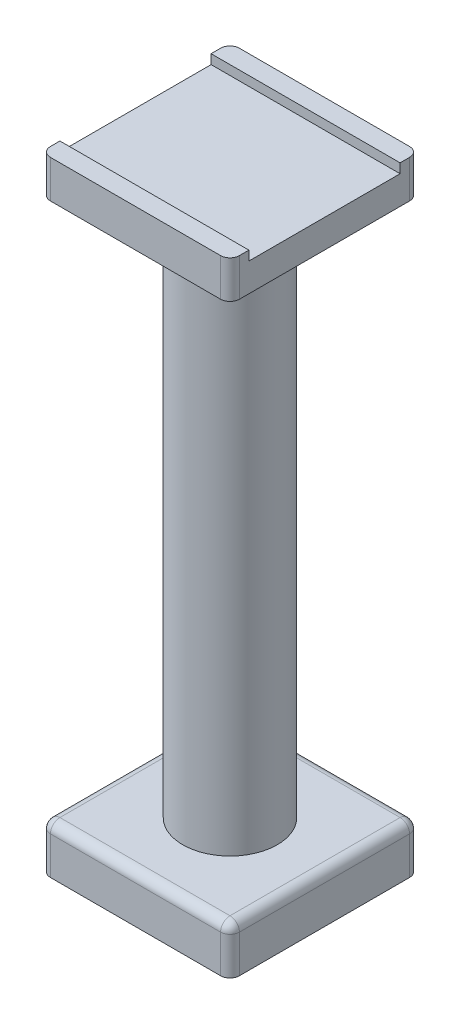
ISO-10303-21;
HEADER;
FILE_DESCRIPTION(('STEP AP214'),'2;1');
FILE_NAME('part.step','',(''),(''),'','','');
FILE_SCHEMA(('AUTOMOTIVE_DESIGN { 1 0 10303 214 1 1 1 1 }'));
ENDSEC;
DATA;
#1=APPLICATION_CONTEXT('core data for automotive mechanical design processes');
#2=APPLICATION_PROTOCOL_DEFINITION('international standard','automotive_design',2000,#1);
#3=PRODUCT_CONTEXT('',#1,'mechanical');
#4=PRODUCT('Part','Part','',(#3));
#5=PRODUCT_RELATED_PRODUCT_CATEGORY('part','',(#4));
#6=PRODUCT_DEFINITION_FORMATION('','',#4);
#7=PRODUCT_DEFINITION_CONTEXT('part definition',#1,'design');
#8=PRODUCT_DEFINITION('design','',#6,#7);
#9=PRODUCT_DEFINITION_SHAPE('','',#8);
#10=(LENGTH_UNIT() NAMED_UNIT(*) SI_UNIT(.MILLI.,.METRE.));
#11=(NAMED_UNIT(*) PLANE_ANGLE_UNIT() SI_UNIT($,.RADIAN.));
#12=(NAMED_UNIT(*) SI_UNIT($,.STERADIAN.) SOLID_ANGLE_UNIT());
#13=UNCERTAINTY_MEASURE_WITH_UNIT(LENGTH_MEASURE(1.E-05),#10,'distance_accuracy_value','');
#14=(GEOMETRIC_REPRESENTATION_CONTEXT(3) GLOBAL_UNCERTAINTY_ASSIGNED_CONTEXT((#13)) GLOBAL_UNIT_ASSIGNED_CONTEXT((#10,
#11,#12)) REPRESENTATION_CONTEXT('',''));
#15=CARTESIAN_POINT('',(0.,0.,0.));
#16=DIRECTION('',(0.,0.,1.));
#17=DIRECTION('',(1.,0.,0.));
#18=AXIS2_PLACEMENT_3D('',#15,#16,#17);
#19=CARTESIAN_POINT('',(0.,65.,0.));
#20=DIRECTION('',(0.,1.,0.));
#21=DIRECTION('',(0.,0.,1.));
#22=AXIS2_PLACEMENT_3D('',#19,#20,#21);
#23=PLANE('',#22);
#24=DIRECTION('',(0.,0.,1.));
#25=VECTOR('',#24,1.);
#26=CARTESIAN_POINT('',(-20.,65.,-20.));
#27=LINE('',#26,#25);
#28=CARTESIAN_POINT('',(-20.,65.,-18.));
#29=VERTEX_POINT('',#28);
#30=CARTESIAN_POINT('',(-20.,65.,-2.));
#31=VERTEX_POINT('',#30);
#32=EDGE_CURVE('E244',#29,#31,#27,.T.);
#33=ORIENTED_EDGE('',*,*,#32,.T.);
#34=DIRECTION('',(-1.,0.,0.));
#35=VECTOR('',#34,1.);
#36=CARTESIAN_POINT('',(-20.,65.,-2.));
#37=LINE('',#36,#35);
#38=CARTESIAN_POINT('',(0.,65.,-2.));
#39=VERTEX_POINT('',#38);
#40=EDGE_CURVE('E222',#39,#31,#37,.T.);
#41=ORIENTED_EDGE('',*,*,#40,.F.);
#42=DIRECTION('',(0.,0.,-1.));
#43=VECTOR('',#42,1.);
#44=CARTESIAN_POINT('',(0.,65.,-20.));
#45=LINE('',#44,#43);
#46=CARTESIAN_POINT('',(0.,65.,-18.));
#47=VERTEX_POINT('',#46);
#48=EDGE_CURVE('E209',#39,#47,#45,.T.);
#49=ORIENTED_EDGE('',*,*,#48,.T.);
#50=DIRECTION('',(1.,0.,0.));
#51=VECTOR('',#50,1.);
#52=CARTESIAN_POINT('',(-20.,65.,-18.));
#53=LINE('',#52,#51);
#54=EDGE_CURVE('E212',#29,#47,#53,.T.);
#55=ORIENTED_EDGE('',*,*,#54,.F.);
#56=EDGE_LOOP('',(#33,#41,#49,#55));
#57=FACE_BOUND('',#56,.T.);
#58=ADVANCED_FACE('F39',(#57),#23,.T.);
#59=CARTESIAN_POINT('',(0.,5.,0.));
#60=DIRECTION('',(-1.,0.,0.));
#61=DIRECTION('',(0.,0.,1.));
#62=AXIS2_PLACEMENT_3D('',#59,#60,#61);
#63=PLANE('',#62);
#64=DIRECTION('',(0.,0.,-1.));
#65=VECTOR('',#64,1.);
#66=CARTESIAN_POINT('',(0.,4.,0.));
#67=LINE('',#66,#65);
#68=CARTESIAN_POINT('',(0.,4.,-19.));
#69=VERTEX_POINT('',#68);
#70=CARTESIAN_POINT('',(0.,4.,-1.));
#71=VERTEX_POINT('',#70);
#72=EDGE_CURVE('E338',#69,#71,#67,.F.);
#73=ORIENTED_EDGE('',*,*,#72,.T.);
#74=DIRECTION('',(0.,-1.,0.));
#75=VECTOR('',#74,1.);
#76=CARTESIAN_POINT('',(0.,5.,-1.));
#77=LINE('',#76,#75);
#78=CARTESIAN_POINT('',(0.,0.,-1.));
#79=VERTEX_POINT('',#78);
#80=EDGE_CURVE('E342',#71,#79,#77,.T.);
#81=ORIENTED_EDGE('',*,*,#80,.T.);
#82=DIRECTION('',(0.,0.,-1.));
#83=VECTOR('',#82,1.);
#84=CARTESIAN_POINT('',(0.,0.,0.));
#85=LINE('',#84,#83);
#86=CARTESIAN_POINT('',(0.,0.,-19.));
#87=VERTEX_POINT('',#86);
#88=EDGE_CURVE('E260',#79,#87,#85,.T.);
#89=ORIENTED_EDGE('',*,*,#88,.T.);
#90=DIRECTION('',(0.,-1.,0.));
#91=VECTOR('',#90,1.);
#92=CARTESIAN_POINT('',(0.,5.,-19.));
#93=LINE('',#92,#91);
#94=EDGE_CURVE('E340',#87,#69,#93,.F.);
#95=ORIENTED_EDGE('',*,*,#94,.T.);
#96=EDGE_LOOP('',(#73,#81,#89,#95));
#97=FACE_BOUND('',#96,.T.);
#98=ADVANCED_FACE('F392',(#97),#63,.F.);
#99=CARTESIAN_POINT('',(0.,5.,-20.));
#100=DIRECTION('',(0.,0.,1.));
#101=DIRECTION('',(1.,0.,0.));
#102=AXIS2_PLACEMENT_3D('',#99,#100,#101);
#103=PLANE('',#102);
#104=DIRECTION('',(-1.,0.,0.));
#105=VECTOR('',#104,1.);
#106=CARTESIAN_POINT('',(0.,0.,-20.));
#107=LINE('',#106,#105);
#108=CARTESIAN_POINT('',(-1.,0.,-20.));
#109=VERTEX_POINT('',#108);
#110=CARTESIAN_POINT('',(-19.,0.,-20.));
#111=VERTEX_POINT('',#110);
#112=EDGE_CURVE('E268',#109,#111,#107,.T.);
#113=ORIENTED_EDGE('',*,*,#112,.T.);
#114=DIRECTION('',(0.,-1.,0.));
#115=VECTOR('',#114,1.);
#116=CARTESIAN_POINT('',(-19.,5.,-20.));
#117=LINE('',#116,#115);
#118=CARTESIAN_POINT('',(-19.,4.,-20.));
#119=VERTEX_POINT('',#118);
#120=EDGE_CURVE('E330',#111,#119,#117,.F.);
#121=ORIENTED_EDGE('',*,*,#120,.T.);
#122=DIRECTION('',(-1.,0.,0.));
#123=VECTOR('',#122,1.);
#124=CARTESIAN_POINT('',(0.,4.,-20.));
#125=LINE('',#124,#123);
#126=CARTESIAN_POINT('',(-1.,4.,-20.));
#127=VERTEX_POINT('',#126);
#128=EDGE_CURVE('E326',#119,#127,#125,.F.);
#129=ORIENTED_EDGE('',*,*,#128,.T.);
#130=DIRECTION('',(0.,-1.,0.));
#131=VECTOR('',#130,1.);
#132=CARTESIAN_POINT('',(-1.,5.,-20.));
#133=LINE('',#132,#131);
#134=EDGE_CURVE('E328',#127,#109,#133,.T.);
#135=ORIENTED_EDGE('',*,*,#134,.T.);
#136=EDGE_LOOP('',(#113,#121,#129,#135));
#137=FACE_BOUND('',#136,.T.);
#138=ADVANCED_FACE('F439',(#137),#103,.F.);
#139=CARTESIAN_POINT('',(-20.,5.,0.));
#140=DIRECTION('',(1.,0.,0.));
#141=DIRECTION('',(0.,0.,-1.));
#142=AXIS2_PLACEMENT_3D('',#139,#140,#141);
#143=PLANE('',#142);
#144=DIRECTION('',(0.,0.,1.));
#145=VECTOR('',#144,1.);
#146=CARTESIAN_POINT('',(-20.,4.,-20.));
#147=LINE('',#146,#145);
#148=CARTESIAN_POINT('',(-20.,4.,-1.));
#149=VERTEX_POINT('',#148);
#150=CARTESIAN_POINT('',(-20.,4.,-19.));
#151=VERTEX_POINT('',#150);
#152=EDGE_CURVE('E311',#149,#151,#147,.F.);
#153=ORIENTED_EDGE('',*,*,#152,.T.);
#154=DIRECTION('',(0.,-1.,0.));
#155=VECTOR('',#154,1.);
#156=CARTESIAN_POINT('',(-20.,5.,-19.));
#157=LINE('',#156,#155);
#158=CARTESIAN_POINT('',(-20.,0.,-19.));
#159=VERTEX_POINT('',#158);
#160=EDGE_CURVE('E315',#151,#159,#157,.T.);
#161=ORIENTED_EDGE('',*,*,#160,.T.);
#162=DIRECTION('',(0.,0.,1.));
#163=VECTOR('',#162,1.);
#164=CARTESIAN_POINT('',(-20.,0.,0.));
#165=LINE('',#164,#163);
#166=CARTESIAN_POINT('',(-20.,0.,-1.));
#167=VERTEX_POINT('',#166);
#168=EDGE_CURVE('E271',#159,#167,#165,.T.);
#169=ORIENTED_EDGE('',*,*,#168,.T.);
#170=DIRECTION('',(0.,-1.,0.));
#171=VECTOR('',#170,1.);
#172=CARTESIAN_POINT('',(-20.,5.,-1.));
#173=LINE('',#172,#171);
#174=EDGE_CURVE('E313',#167,#149,#173,.F.);
#175=ORIENTED_EDGE('',*,*,#174,.T.);
#176=EDGE_LOOP('',(#153,#161,#169,#175));
#177=FACE_BOUND('',#176,.T.);
#178=ADVANCED_FACE('F427',(#177),#143,.F.);
#179=CARTESIAN_POINT('',(0.,5.,0.));
#180=DIRECTION('',(0.,0.,-1.));
#181=DIRECTION('',(-1.,0.,0.));
#182=AXIS2_PLACEMENT_3D('',#179,#180,#181);
#183=PLANE('',#182);
#184=DIRECTION('',(1.,0.,0.));
#185=VECTOR('',#184,1.);
#186=CARTESIAN_POINT('',(-20.,4.,0.));
#187=LINE('',#186,#185);
#188=CARTESIAN_POINT('',(-1.,4.,0.));
#189=VERTEX_POINT('',#188);
#190=CARTESIAN_POINT('',(-19.,4.,0.));
#191=VERTEX_POINT('',#190);
#192=EDGE_CURVE('E332',#189,#191,#187,.F.);
#193=ORIENTED_EDGE('',*,*,#192,.T.);
#194=DIRECTION('',(0.,-1.,0.));
#195=VECTOR('',#194,1.);
#196=CARTESIAN_POINT('',(-19.,5.,0.));
#197=LINE('',#196,#195);
#198=CARTESIAN_POINT('',(-19.,0.,0.));
#199=VERTEX_POINT('',#198);
#200=EDGE_CURVE('E336',#191,#199,#197,.T.);
#201=ORIENTED_EDGE('',*,*,#200,.T.);
#202=DIRECTION('',(1.,0.,0.));
#203=VECTOR('',#202,1.);
#204=CARTESIAN_POINT('',(0.,0.,0.));
#205=LINE('',#204,#203);
#206=CARTESIAN_POINT('',(-1.,0.,0.));
#207=VERTEX_POINT('',#206);
#208=EDGE_CURVE('E265',#199,#207,#205,.T.);
#209=ORIENTED_EDGE('',*,*,#208,.T.);
#210=DIRECTION('',(0.,-1.,0.));
#211=VECTOR('',#210,1.);
#212=CARTESIAN_POINT('',(-1.,5.,0.));
#213=LINE('',#212,#211);
#214=EDGE_CURVE('E334',#207,#189,#213,.F.);
#215=ORIENTED_EDGE('',*,*,#214,.T.);
#216=EDGE_LOOP('',(#193,#201,#209,#215));
#217=FACE_BOUND('',#216,.T.);
#218=ADVANCED_FACE('F435',(#217),#183,.F.);
#219=CARTESIAN_POINT('',(0.,5.,0.));
#220=DIRECTION('',(0.,1.,0.));
#221=DIRECTION('',(0.,0.,1.));
#222=AXIS2_PLACEMENT_3D('',#219,#220,#221);
#223=PLANE('',#222);
#224=DIRECTION('',(0.,0.,-1.));
#225=VECTOR('',#224,1.);
#226=CARTESIAN_POINT('',(-1.,5.,-20.));
#227=LINE('',#226,#225);
#228=CARTESIAN_POINT('',(-1.,5.,-1.));
#229=VERTEX_POINT('',#228);
#230=CARTESIAN_POINT('',(-1.,5.,-19.));
#231=VERTEX_POINT('',#230);
#232=EDGE_CURVE('E48',#229,#231,#227,.T.);
#233=ORIENTED_EDGE('',*,*,#232,.T.);
#234=DIRECTION('',(-1.,0.,0.));
#235=VECTOR('',#234,1.);
#236=CARTESIAN_POINT('',(-20.,5.,-19.));
#237=LINE('',#236,#235);
#238=CARTESIAN_POINT('',(-19.,5.,-19.));
#239=VERTEX_POINT('',#238);
#240=EDGE_CURVE('E11',#231,#239,#237,.T.);
#241=ORIENTED_EDGE('',*,*,#240,.T.);
#242=DIRECTION('',(0.,0.,1.));
#243=VECTOR('',#242,1.);
#244=CARTESIAN_POINT('',(-19.,5.,0.));
#245=LINE('',#244,#243);
#246=CARTESIAN_POINT('',(-19.,5.,-1.));
#247=VERTEX_POINT('',#246);
#248=EDGE_CURVE('E346',#239,#247,#245,.T.);
#249=ORIENTED_EDGE('',*,*,#248,.T.);
#250=DIRECTION('',(1.,0.,0.));
#251=VECTOR('',#250,1.);
#252=CARTESIAN_POINT('',(0.,5.,-1.));
#253=LINE('',#252,#251);
#254=EDGE_CURVE('E344',#247,#229,#253,.T.);
#255=ORIENTED_EDGE('',*,*,#254,.T.);
#256=EDGE_LOOP('',(#233,#241,#249,#255));
#257=FACE_BOUND('',#256,.T.);
#258=CARTESIAN_POINT('',(-10.,5.,-10.));
#259=DIRECTION('',(0.,1.,0.));
#260=DIRECTION('',(0.,0.,1.));
#261=AXIS2_PLACEMENT_3D('',#258,#259,#260);
#262=CIRCLE('',#261,5.);
#263=CARTESIAN_POINT('',(-10.,5.,-15.));
#264=VERTEX_POINT('',#263);
#265=EDGE_CURVE('E261',#264,#264,#262,.T.);
#266=ORIENTED_EDGE('',*,*,#265,.F.);
#267=EDGE_LOOP('',(#266));
#268=FACE_BOUND('',#267,.T.);
#269=ADVANCED_FACE('F413',(#257,#268),#223,.T.);
#270=CARTESIAN_POINT('',(0.,0.,0.));
#271=DIRECTION('',(0.,1.,0.));
#272=DIRECTION('',(0.,0.,1.));
#273=AXIS2_PLACEMENT_3D('',#270,#271,#272);
#274=PLANE('',#273);
#275=ORIENTED_EDGE('',*,*,#168,.F.);
#276=CARTESIAN_POINT('',(-19.,0.,-19.));
#277=DIRECTION('',(0.,1.,0.));
#278=DIRECTION('',(0.,0.,1.));
#279=AXIS2_PLACEMENT_3D('',#276,#277,#278);
#280=CIRCLE('',#279,1.);
#281=EDGE_CURVE('E324',#159,#111,#280,.F.);
#282=ORIENTED_EDGE('',*,*,#281,.T.);
#283=ORIENTED_EDGE('',*,*,#112,.F.);
#284=CARTESIAN_POINT('',(-1.,0.,-19.));
#285=DIRECTION('',(0.,1.,0.));
#286=DIRECTION('',(0.,0.,1.));
#287=AXIS2_PLACEMENT_3D('',#284,#285,#286);
#288=CIRCLE('',#287,1.);
#289=EDGE_CURVE('E318',#109,#87,#288,.F.);
#290=ORIENTED_EDGE('',*,*,#289,.T.);
#291=ORIENTED_EDGE('',*,*,#88,.F.);
#292=CARTESIAN_POINT('',(-1.,0.,-1.));
#293=DIRECTION('',(0.,1.,0.));
#294=DIRECTION('',(0.,0.,1.));
#295=AXIS2_PLACEMENT_3D('',#292,#293,#294);
#296=CIRCLE('',#295,1.);
#297=EDGE_CURVE('E320',#79,#207,#296,.F.);
#298=ORIENTED_EDGE('',*,*,#297,.T.);
#299=ORIENTED_EDGE('',*,*,#208,.F.);
#300=CARTESIAN_POINT('',(-19.,0.,-1.));
#301=DIRECTION('',(0.,1.,0.));
#302=DIRECTION('',(0.,0.,1.));
#303=AXIS2_PLACEMENT_3D('',#300,#301,#302);
#304=CIRCLE('',#303,1.);
#305=EDGE_CURVE('E322',#199,#167,#304,.F.);
#306=ORIENTED_EDGE('',*,*,#305,.T.);
#307=EDGE_LOOP('',(#275,#282,#283,#290,#291,#298,#299,#306));
#308=FACE_BOUND('',#307,.T.);
#309=ADVANCED_FACE('F396',(#308),#274,.F.);
#310=CARTESIAN_POINT('',(-10.,62.,-10.));
#311=DIRECTION('',(0.,-1.,0.));
#312=DIRECTION('',(0.,0.,-1.));
#313=AXIS2_PLACEMENT_3D('',#310,#311,#312);
#314=CYLINDRICAL_SURFACE('',#313,5.);
#315=CARTESIAN_POINT('',(-10.,62.,-10.));
#316=DIRECTION('',(0.,1.,0.));
#317=DIRECTION('',(0.,0.,1.));
#318=AXIS2_PLACEMENT_3D('',#315,#316,#317);
#319=CIRCLE('',#318,5.);
#320=CARTESIAN_POINT('',(-10.,62.,-15.));
#321=VERTEX_POINT('',#320);
#322=EDGE_CURVE('E249',#321,#321,#319,.T.);
#323=CARTESIAN_POINT('',(-10.,62.,-15.));
#324=CARTESIAN_POINT('',(-10.,61.40625,-15.));
#325=CARTESIAN_POINT('',(-10.,60.8125,-15.));
#326=CARTESIAN_POINT('',(-10.,59.625,-15.));
#327=CARTESIAN_POINT('',(-10.,59.03125,-15.));
#328=CARTESIAN_POINT('',(-10.,57.84375,-15.));
#329=CARTESIAN_POINT('',(-10.,57.25,-15.));
#330=CARTESIAN_POINT('',(-10.,56.0625,-15.));
#331=CARTESIAN_POINT('',(-10.,55.46875,-15.));
#332=CARTESIAN_POINT('',(-10.,54.28125,-15.));
#333=CARTESIAN_POINT('',(-10.,53.6875,-15.));
#334=CARTESIAN_POINT('',(-10.,52.5,-15.));
#335=CARTESIAN_POINT('',(-10.,51.90625,-15.));
#336=CARTESIAN_POINT('',(-10.,50.71875,-15.));
#337=CARTESIAN_POINT('',(-10.,50.125,-15.));
#338=CARTESIAN_POINT('',(-10.,48.9375,-15.));
#339=CARTESIAN_POINT('',(-10.,48.34375,-15.));
#340=CARTESIAN_POINT('',(-10.,47.15625,-15.));
#341=CARTESIAN_POINT('',(-10.,46.5625,-15.));
#342=CARTESIAN_POINT('',(-10.,45.375,-15.));
#343=CARTESIAN_POINT('',(-10.,44.78125,-15.));
#344=CARTESIAN_POINT('',(-10.,43.59375,-15.));
#345=CARTESIAN_POINT('',(-10.,43.,-15.));
#346=CARTESIAN_POINT('',(-10.,41.8125,-15.));
#347=CARTESIAN_POINT('',(-10.,41.21875,-15.));
#348=CARTESIAN_POINT('',(-10.,40.03125,-15.));
#349=CARTESIAN_POINT('',(-10.,39.4375,-15.));
#350=CARTESIAN_POINT('',(-10.,38.25,-15.));
#351=CARTESIAN_POINT('',(-10.,37.65625,-15.));
#352=CARTESIAN_POINT('',(-10.,36.46875,-15.));
#353=CARTESIAN_POINT('',(-10.,35.875,-15.));
#354=CARTESIAN_POINT('',(-10.,34.6875,-15.));
#355=CARTESIAN_POINT('',(-10.,34.09375,-15.));
#356=CARTESIAN_POINT('',(-10.,32.90625,-15.));
#357=CARTESIAN_POINT('',(-10.,32.3125,-15.));
#358=CARTESIAN_POINT('',(-10.,31.125,-15.));
#359=CARTESIAN_POINT('',(-10.,30.53125,-15.));
#360=CARTESIAN_POINT('',(-10.,29.34375,-15.));
#361=CARTESIAN_POINT('',(-10.,28.75,-15.));
#362=CARTESIAN_POINT('',(-10.,27.5625,-15.));
#363=CARTESIAN_POINT('',(-10.,26.96875,-15.));
#364=CARTESIAN_POINT('',(-10.,25.78125,-15.));
#365=CARTESIAN_POINT('',(-10.,25.1875,-15.));
#366=CARTESIAN_POINT('',(-10.,24.,-15.));
#367=CARTESIAN_POINT('',(-10.,23.40625,-15.));
#368=CARTESIAN_POINT('',(-10.,22.21875,-15.));
#369=CARTESIAN_POINT('',(-10.,21.625,-15.));
#370=CARTESIAN_POINT('',(-10.,20.4375,-15.));
#371=CARTESIAN_POINT('',(-10.,19.84375,-15.));
#372=CARTESIAN_POINT('',(-10.,18.65625,-15.));
#373=CARTESIAN_POINT('',(-10.,18.0625,-15.));
#374=CARTESIAN_POINT('',(-10.,16.875,-15.));
#375=CARTESIAN_POINT('',(-10.,16.28125,-15.));
#376=CARTESIAN_POINT('',(-10.,15.09375,-15.));
#377=CARTESIAN_POINT('',(-10.,14.5,-15.));
#378=CARTESIAN_POINT('',(-10.,13.3125,-15.));
#379=CARTESIAN_POINT('',(-10.,12.71875,-15.));
#380=CARTESIAN_POINT('',(-10.,11.53125,-15.));
#381=CARTESIAN_POINT('',(-10.,10.9375,-15.));
#382=CARTESIAN_POINT('',(-10.,9.75,-15.));
#383=CARTESIAN_POINT('',(-10.,9.15625,-15.));
#384=CARTESIAN_POINT('',(-10.,7.96875,-15.));
#385=CARTESIAN_POINT('',(-10.,7.375,-15.));
#386=CARTESIAN_POINT('',(-10.,6.1875,-15.));
#387=CARTESIAN_POINT('',(-10.,5.59375,-15.));
#388=CARTESIAN_POINT('',(-10.,5.,-15.));
#389=B_SPLINE_CURVE_WITH_KNOTS('',3,(#323,#324,#325,#326,#327,#328,#329,#330,#331,#332,#333,
#334,#335,#336,#337,#338,#339,#340,#341,#342,#343,#344,#345,#346,#347,#348,#349,#350,#351,#352,
#353,#354,#355,#356,#357,#358,#359,#360,#361,#362,#363,#364,#365,#366,#367,#368,#369,#370,#371,
#372,#373,#374,#375,#376,#377,#378,#379,#380,#381,#382,#383,#384,#385,#386,#387,#388),
.UNSPECIFIED.,.F.,.F.,(4,2,2,2,2,2,2,2,2,2,2,2,2,2,2,2,2,2,2,2,2,2,2,2,2,2,2,2,2,2,2,2,4),(0.,
1.78125,3.5625,5.34374999999999,7.125,8.90625,10.6875,12.46875,14.25,16.03125,17.8125,19.59375,
21.375,23.15625,24.9375,26.71875,28.5,30.28125,32.0625,33.84375,35.625,37.40625,39.1875,
40.96875,42.75,44.53125,46.3125,48.09375,49.875,51.65625,53.4375,55.21875,57.),.UNSPECIFIED.);
#390=EDGE_CURVE('BSEAM478',#321,#264,#389,.T.);
#391=ORIENTED_EDGE('',*,*,#322,.F.);
#392=ORIENTED_EDGE('',*,*,#265,.T.);
#393=ORIENTED_EDGE('',*,*,#390,.T.);
#394=ORIENTED_EDGE('',*,*,#390,.F.);
#395=EDGE_LOOP('',(#391,#393,#392,#394));
#396=FACE_BOUND('',#395,.T.);
#397=ADVANCED_FACE('F478',(#396),#314,.T.);
#398=CARTESIAN_POINT('',(-20.,65.,-20.));
#399=DIRECTION('',(1.,0.,0.));
#400=DIRECTION('',(0.,0.,-1.));
#401=AXIS2_PLACEMENT_3D('',#398,#399,#400);
#402=PLANE('',#401);
#403=DIRECTION('',(0.,0.,-1.));
#404=VECTOR('',#403,1.);
#405=CARTESIAN_POINT('',(-20.,66.,-18.));
#406=LINE('',#405,#404);
#407=CARTESIAN_POINT('',(-20.,66.,-18.));
#408=VERTEX_POINT('',#407);
#409=CARTESIAN_POINT('',(-20.,66.,-19.));
#410=VERTEX_POINT('',#409);
#411=EDGE_CURVE('E225',#408,#410,#406,.T.);
#412=ORIENTED_EDGE('',*,*,#411,.T.);
#413=DIRECTION('',(0.,-1.,0.));
#414=VECTOR('',#413,1.);
#415=CARTESIAN_POINT('',(-20.,65.,-19.));
#416=LINE('',#415,#414);
#417=CARTESIAN_POINT('',(-20.,62.,-19.));
#418=VERTEX_POINT('',#417);
#419=EDGE_CURVE('E286',#410,#418,#416,.T.);
#420=ORIENTED_EDGE('',*,*,#419,.T.);
#421=DIRECTION('',(0.,0.,1.));
#422=VECTOR('',#421,1.);
#423=CARTESIAN_POINT('',(-20.,62.,-20.));
#424=LINE('',#423,#422);
#425=CARTESIAN_POINT('',(-20.,62.,-1.));
#426=VERTEX_POINT('',#425);
#427=EDGE_CURVE('E242',#418,#426,#424,.T.);
#428=ORIENTED_EDGE('',*,*,#427,.T.);
#429=DIRECTION('',(0.,-1.,0.));
#430=VECTOR('',#429,1.);
#431=CARTESIAN_POINT('',(-20.,65.,-1.));
#432=LINE('',#431,#430);
#433=CARTESIAN_POINT('',(-20.,66.,-1.));
#434=VERTEX_POINT('',#433);
#435=EDGE_CURVE('E284',#426,#434,#432,.F.);
#436=ORIENTED_EDGE('',*,*,#435,.T.);
#437=DIRECTION('',(0.,0.,1.));
#438=VECTOR('',#437,1.);
#439=CARTESIAN_POINT('',(-20.,66.,0.));
#440=LINE('',#439,#438);
#441=CARTESIAN_POINT('',(-20.,66.,-2.));
#442=VERTEX_POINT('',#441);
#443=EDGE_CURVE('E223',#442,#434,#440,.T.);
#444=ORIENTED_EDGE('',*,*,#443,.F.);
#445=DIRECTION('',(0.,-1.,0.));
#446=VECTOR('',#445,1.);
#447=CARTESIAN_POINT('',(-20.,66.,-2.));
#448=LINE('',#447,#446);
#449=EDGE_CURVE('E213',#442,#31,#448,.T.);
#450=ORIENTED_EDGE('',*,*,#449,.T.);
#451=ORIENTED_EDGE('',*,*,#32,.F.);
#452=DIRECTION('',(0.,-1.,0.));
#453=VECTOR('',#452,1.);
#454=CARTESIAN_POINT('',(-20.,66.,-18.));
#455=LINE('',#454,#453);
#456=EDGE_CURVE('E239',#408,#29,#455,.T.);
#457=ORIENTED_EDGE('',*,*,#456,.F.);
#458=EDGE_LOOP('',(#412,#420,#428,#436,#444,#450,#451,#457));
#459=FACE_BOUND('',#458,.T.);
#460=ADVANCED_FACE('F474',(#459),#402,.F.);
#461=CARTESIAN_POINT('',(-20.,65.,0.));
#462=DIRECTION('',(0.,0.,-1.));
#463=DIRECTION('',(-1.,0.,0.));
#464=AXIS2_PLACEMENT_3D('',#461,#462,#463);
#465=PLANE('',#464);
#466=DIRECTION('',(1.,0.,0.));
#467=VECTOR('',#466,1.);
#468=CARTESIAN_POINT('',(-20.,66.,0.));
#469=LINE('',#468,#467);
#470=CARTESIAN_POINT('',(-19.,66.,0.));
#471=VERTEX_POINT('',#470);
#472=CARTESIAN_POINT('',(-1.,66.,0.));
#473=VERTEX_POINT('',#472);
#474=EDGE_CURVE('E202',#471,#473,#469,.T.);
#475=ORIENTED_EDGE('',*,*,#474,.F.);
#476=DIRECTION('',(0.,-1.,0.));
#477=VECTOR('',#476,1.);
#478=CARTESIAN_POINT('',(-19.,65.,0.));
#479=LINE('',#478,#477);
#480=CARTESIAN_POINT('',(-19.,62.,0.));
#481=VERTEX_POINT('',#480);
#482=EDGE_CURVE('E304',#471,#481,#479,.T.);
#483=ORIENTED_EDGE('',*,*,#482,.T.);
#484=DIRECTION('',(1.,0.,0.));
#485=VECTOR('',#484,1.);
#486=CARTESIAN_POINT('',(-20.,62.,0.));
#487=LINE('',#486,#485);
#488=CARTESIAN_POINT('',(-1.,62.,0.));
#489=VERTEX_POINT('',#488);
#490=EDGE_CURVE('E252',#481,#489,#487,.T.);
#491=ORIENTED_EDGE('',*,*,#490,.T.);
#492=DIRECTION('',(0.,-1.,0.));
#493=VECTOR('',#492,1.);
#494=CARTESIAN_POINT('',(-1.,65.,0.));
#495=LINE('',#494,#493);
#496=EDGE_CURVE('E280',#489,#473,#495,.F.);
#497=ORIENTED_EDGE('',*,*,#496,.T.);
#498=EDGE_LOOP('',(#475,#483,#491,#497));
#499=FACE_BOUND('',#498,.T.);
#500=ADVANCED_FACE('F471',(#499),#465,.F.);
#501=CARTESIAN_POINT('',(0.,65.,-20.));
#502=DIRECTION('',(-1.,0.,0.));
#503=DIRECTION('',(0.,0.,1.));
#504=AXIS2_PLACEMENT_3D('',#501,#502,#503);
#505=PLANE('',#504);
#506=DIRECTION('',(0.,0.,-1.));
#507=VECTOR('',#506,1.);
#508=CARTESIAN_POINT('',(0.,62.,-20.));
#509=LINE('',#508,#507);
#510=CARTESIAN_POINT('',(0.,62.,-1.));
#511=VERTEX_POINT('',#510);
#512=CARTESIAN_POINT('',(0.,62.,-19.));
#513=VERTEX_POINT('',#512);
#514=EDGE_CURVE('E254',#511,#513,#509,.T.);
#515=ORIENTED_EDGE('',*,*,#514,.T.);
#516=DIRECTION('',(0.,-1.,0.));
#517=VECTOR('',#516,1.);
#518=CARTESIAN_POINT('',(0.,65.,-19.));
#519=LINE('',#518,#517);
#520=CARTESIAN_POINT('',(0.,66.,-19.));
#521=VERTEX_POINT('',#520);
#522=EDGE_CURVE('E309',#513,#521,#519,.F.);
#523=ORIENTED_EDGE('',*,*,#522,.T.);
#524=DIRECTION('',(0.,0.,-1.));
#525=VECTOR('',#524,1.);
#526=CARTESIAN_POINT('',(0.,66.,-18.));
#527=LINE('',#526,#525);
#528=CARTESIAN_POINT('',(0.,66.,-18.));
#529=VERTEX_POINT('',#528);
#530=EDGE_CURVE('E231',#529,#521,#527,.T.);
#531=ORIENTED_EDGE('',*,*,#530,.F.);
#532=DIRECTION('',(0.,-1.,0.));
#533=VECTOR('',#532,1.);
#534=CARTESIAN_POINT('',(0.,66.,-18.));
#535=LINE('',#534,#533);
#536=EDGE_CURVE('E236',#529,#47,#535,.T.);
#537=ORIENTED_EDGE('',*,*,#536,.T.);
#538=ORIENTED_EDGE('',*,*,#48,.F.);
#539=DIRECTION('',(0.,-1.,0.));
#540=VECTOR('',#539,1.);
#541=CARTESIAN_POINT('',(0.,66.,-2.));
#542=LINE('',#541,#540);
#543=CARTESIAN_POINT('',(0.,66.,-2.));
#544=VERTEX_POINT('',#543);
#545=EDGE_CURVE('E205',#544,#39,#542,.T.);
#546=ORIENTED_EDGE('',*,*,#545,.F.);
#547=DIRECTION('',(0.,0.,-1.));
#548=VECTOR('',#547,1.);
#549=CARTESIAN_POINT('',(0.,66.,0.));
#550=LINE('',#549,#548);
#551=CARTESIAN_POINT('',(0.,66.,-1.));
#552=VERTEX_POINT('',#551);
#553=EDGE_CURVE('E190',#552,#544,#550,.T.);
#554=ORIENTED_EDGE('',*,*,#553,.F.);
#555=DIRECTION('',(0.,-1.,0.));
#556=VECTOR('',#555,1.);
#557=CARTESIAN_POINT('',(0.,65.,-1.));
#558=LINE('',#557,#556);
#559=EDGE_CURVE('E264',#552,#511,#558,.T.);
#560=ORIENTED_EDGE('',*,*,#559,.T.);
#561=EDGE_LOOP('',(#515,#523,#531,#537,#538,#546,#554,#560));
#562=FACE_BOUND('',#561,.T.);
#563=ADVANCED_FACE('F207',(#562),#505,.F.);
#564=CARTESIAN_POINT('',(-20.,65.,-20.));
#565=DIRECTION('',(0.,0.,1.));
#566=DIRECTION('',(1.,0.,0.));
#567=AXIS2_PLACEMENT_3D('',#564,#565,#566);
#568=PLANE('',#567);
#569=DIRECTION('',(-1.,0.,0.));
#570=VECTOR('',#569,1.);
#571=CARTESIAN_POINT('',(-20.,62.,-20.));
#572=LINE('',#571,#570);
#573=CARTESIAN_POINT('',(-1.,62.,-20.));
#574=VERTEX_POINT('',#573);
#575=CARTESIAN_POINT('',(-19.,62.,-20.));
#576=VERTEX_POINT('',#575);
#577=EDGE_CURVE('E247',#574,#576,#572,.T.);
#578=ORIENTED_EDGE('',*,*,#577,.T.);
#579=DIRECTION('',(0.,-1.,0.));
#580=VECTOR('',#579,1.);
#581=CARTESIAN_POINT('',(-19.,65.,-20.));
#582=LINE('',#581,#580);
#583=CARTESIAN_POINT('',(-19.,66.,-20.));
#584=VERTEX_POINT('',#583);
#585=EDGE_CURVE('E298',#576,#584,#582,.F.);
#586=ORIENTED_EDGE('',*,*,#585,.T.);
#587=DIRECTION('',(1.,0.,0.));
#588=VECTOR('',#587,1.);
#589=CARTESIAN_POINT('',(-20.,66.,-20.));
#590=LINE('',#589,#588);
#591=CARTESIAN_POINT('',(-1.,66.,-20.));
#592=VERTEX_POINT('',#591);
#593=EDGE_CURVE('E228',#584,#592,#590,.T.);
#594=ORIENTED_EDGE('',*,*,#593,.T.);
#595=DIRECTION('',(0.,-1.,0.));
#596=VECTOR('',#595,1.);
#597=CARTESIAN_POINT('',(-1.,65.,-20.));
#598=LINE('',#597,#596);
#599=EDGE_CURVE('E295',#592,#574,#598,.T.);
#600=ORIENTED_EDGE('',*,*,#599,.T.);
#601=EDGE_LOOP('',(#578,#586,#594,#600));
#602=FACE_BOUND('',#601,.T.);
#603=ADVANCED_FACE('F464',(#602),#568,.F.);
#604=CARTESIAN_POINT('',(0.,62.,0.));
#605=DIRECTION('',(0.,1.,0.));
#606=DIRECTION('',(0.,0.,1.));
#607=AXIS2_PLACEMENT_3D('',#604,#605,#606);
#608=PLANE('',#607);
#609=ORIENTED_EDGE('',*,*,#322,.T.);
#610=EDGE_LOOP('',(#609));
#611=FACE_BOUND('',#610,.T.);
#612=ORIENTED_EDGE('',*,*,#427,.F.);
#613=CARTESIAN_POINT('',(-19.,62.,-19.));
#614=DIRECTION('',(0.,1.,0.));
#615=DIRECTION('',(0.,0.,1.));
#616=AXIS2_PLACEMENT_3D('',#613,#614,#615);
#617=CIRCLE('',#616,1.);
#618=EDGE_CURVE('E293',#418,#576,#617,.F.);
#619=ORIENTED_EDGE('',*,*,#618,.T.);
#620=ORIENTED_EDGE('',*,*,#577,.F.);
#621=CARTESIAN_POINT('',(-1.,62.,-19.));
#622=DIRECTION('',(0.,1.,0.));
#623=DIRECTION('',(0.,0.,1.));
#624=AXIS2_PLACEMENT_3D('',#621,#622,#623);
#625=CIRCLE('',#624,1.);
#626=EDGE_CURVE('E289',#574,#513,#625,.F.);
#627=ORIENTED_EDGE('',*,*,#626,.T.);
#628=ORIENTED_EDGE('',*,*,#514,.F.);
#629=CARTESIAN_POINT('',(-1.,62.,-1.));
#630=DIRECTION('',(0.,1.,0.));
#631=DIRECTION('',(0.,0.,1.));
#632=AXIS2_PLACEMENT_3D('',#629,#630,#631);
#633=CIRCLE('',#632,1.);
#634=EDGE_CURVE('E277',#511,#489,#633,.F.);
#635=ORIENTED_EDGE('',*,*,#634,.T.);
#636=ORIENTED_EDGE('',*,*,#490,.F.);
#637=CARTESIAN_POINT('',(-19.,62.,-1.));
#638=DIRECTION('',(0.,1.,0.));
#639=DIRECTION('',(0.,0.,1.));
#640=AXIS2_PLACEMENT_3D('',#637,#638,#639);
#641=CIRCLE('',#640,1.);
#642=EDGE_CURVE('E291',#481,#426,#641,.F.);
#643=ORIENTED_EDGE('',*,*,#642,.T.);
#644=EDGE_LOOP('',(#612,#619,#620,#627,#628,#635,#636,#643));
#645=FACE_BOUND('',#644,.T.);
#646=ADVANCED_FACE('F461',(#611,#645),#608,.F.);
#647=CARTESIAN_POINT('',(-20.,66.,-18.));
#648=DIRECTION('',(0.,0.,-1.));
#649=DIRECTION('',(-1.,0.,0.));
#650=AXIS2_PLACEMENT_3D('',#647,#648,#649);
#651=PLANE('',#650);
#652=ORIENTED_EDGE('',*,*,#54,.T.);
#653=ORIENTED_EDGE('',*,*,#536,.F.);
#654=DIRECTION('',(1.,0.,0.));
#655=VECTOR('',#654,1.);
#656=CARTESIAN_POINT('',(-20.,66.,-18.));
#657=LINE('',#656,#655);
#658=EDGE_CURVE('E234',#408,#529,#657,.T.);
#659=ORIENTED_EDGE('',*,*,#658,.F.);
#660=ORIENTED_EDGE('',*,*,#456,.T.);
#661=EDGE_LOOP('',(#652,#653,#659,#660));
#662=FACE_BOUND('',#661,.T.);
#663=ADVANCED_FACE('F459',(#662),#651,.F.);
#664=CARTESIAN_POINT('',(0.,66.,0.));
#665=DIRECTION('',(0.,-1.,0.));
#666=DIRECTION('',(0.,0.,-1.));
#667=AXIS2_PLACEMENT_3D('',#664,#665,#666);
#668=PLANE('',#667);
#669=ORIENTED_EDGE('',*,*,#593,.F.);
#670=CARTESIAN_POINT('',(-19.,66.,-19.));
#671=DIRECTION('',(0.,-1.,0.));
#672=DIRECTION('',(0.,0.,-1.));
#673=AXIS2_PLACEMENT_3D('',#670,#671,#672);
#674=CIRCLE('',#673,1.);
#675=EDGE_CURVE('E302',#584,#410,#674,.F.);
#676=ORIENTED_EDGE('',*,*,#675,.T.);
#677=ORIENTED_EDGE('',*,*,#411,.F.);
#678=ORIENTED_EDGE('',*,*,#658,.T.);
#679=ORIENTED_EDGE('',*,*,#530,.T.);
#680=CARTESIAN_POINT('',(-1.,66.,-19.));
#681=DIRECTION('',(0.,-1.,0.));
#682=DIRECTION('',(0.,0.,-1.));
#683=AXIS2_PLACEMENT_3D('',#680,#681,#682);
#684=CIRCLE('',#683,1.);
#685=EDGE_CURVE('E300',#521,#592,#684,.F.);
#686=ORIENTED_EDGE('',*,*,#685,.T.);
#687=EDGE_LOOP('',(#669,#676,#677,#678,#679,#686));
#688=FACE_BOUND('',#687,.T.);
#689=ADVANCED_FACE('F516',(#688),#668,.F.);
#690=CARTESIAN_POINT('',(-20.,66.,-2.));
#691=DIRECTION('',(0.,0.,1.));
#692=DIRECTION('',(1.,0.,0.));
#693=AXIS2_PLACEMENT_3D('',#690,#691,#692);
#694=PLANE('',#693);
#695=ORIENTED_EDGE('',*,*,#40,.T.);
#696=ORIENTED_EDGE('',*,*,#449,.F.);
#697=DIRECTION('',(-1.,0.,0.));
#698=VECTOR('',#697,1.);
#699=CARTESIAN_POINT('',(-20.,66.,-2.));
#700=LINE('',#699,#698);
#701=EDGE_CURVE('E195',#544,#442,#700,.T.);
#702=ORIENTED_EDGE('',*,*,#701,.F.);
#703=ORIENTED_EDGE('',*,*,#545,.T.);
#704=EDGE_LOOP('',(#695,#696,#702,#703));
#705=FACE_BOUND('',#704,.T.);
#706=ADVANCED_FACE('F215',(#705),#694,.F.);
#707=CARTESIAN_POINT('',(0.,66.,0.));
#708=DIRECTION('',(0.,-1.,0.));
#709=DIRECTION('',(0.,0.,-1.));
#710=AXIS2_PLACEMENT_3D('',#707,#708,#709);
#711=PLANE('',#710);
#712=ORIENTED_EDGE('',*,*,#443,.T.);
#713=CARTESIAN_POINT('',(-19.,66.,-1.));
#714=DIRECTION('',(0.,-1.,0.));
#715=DIRECTION('',(0.,0.,-1.));
#716=AXIS2_PLACEMENT_3D('',#713,#714,#715);
#717=CIRCLE('',#716,1.);
#718=EDGE_CURVE('E307',#434,#471,#717,.F.);
#719=ORIENTED_EDGE('',*,*,#718,.T.);
#720=ORIENTED_EDGE('',*,*,#474,.T.);
#721=CARTESIAN_POINT('',(-1.,66.,-1.));
#722=DIRECTION('',(0.,-1.,0.));
#723=DIRECTION('',(0.,0.,-1.));
#724=AXIS2_PLACEMENT_3D('',#721,#722,#723);
#725=CIRCLE('',#724,1.);
#726=EDGE_CURVE('E198',#473,#552,#725,.F.);
#727=ORIENTED_EDGE('',*,*,#726,.T.);
#728=ORIENTED_EDGE('',*,*,#553,.T.);
#729=ORIENTED_EDGE('',*,*,#701,.T.);
#730=EDGE_LOOP('',(#712,#719,#720,#727,#728,#729));
#731=FACE_BOUND('',#730,.T.);
#732=ADVANCED_FACE('F193',(#731),#711,.F.);
#733=CARTESIAN_POINT('',(-1.,65.,-1.));
#734=DIRECTION('',(0.,-1.,0.));
#735=DIRECTION('',(0.,0.,-1.));
#736=AXIS2_PLACEMENT_3D('',#733,#734,#735);
#737=CYLINDRICAL_SURFACE('',#736,1.);
#738=ORIENTED_EDGE('',*,*,#726,.F.);
#739=ORIENTED_EDGE('',*,*,#496,.F.);
#740=ORIENTED_EDGE('',*,*,#634,.F.);
#741=ORIENTED_EDGE('',*,*,#559,.F.);
#742=EDGE_LOOP('',(#738,#739,#740,#741));
#743=FACE_BOUND('',#742,.T.);
#744=ADVANCED_FACE('F493',(#743),#737,.T.);
#745=CARTESIAN_POINT('',(-19.,65.,-19.));
#746=DIRECTION('',(0.,-1.,0.));
#747=DIRECTION('',(0.,0.,-1.));
#748=AXIS2_PLACEMENT_3D('',#745,#746,#747);
#749=CYLINDRICAL_SURFACE('',#748,1.);
#750=ORIENTED_EDGE('',*,*,#675,.F.);
#751=ORIENTED_EDGE('',*,*,#585,.F.);
#752=ORIENTED_EDGE('',*,*,#618,.F.);
#753=ORIENTED_EDGE('',*,*,#419,.F.);
#754=EDGE_LOOP('',(#750,#751,#752,#753));
#755=FACE_BOUND('',#754,.T.);
#756=ADVANCED_FACE('F496',(#755),#749,.T.);
#757=CARTESIAN_POINT('',(-19.,65.,-1.));
#758=DIRECTION('',(0.,-1.,0.));
#759=DIRECTION('',(0.,0.,-1.));
#760=AXIS2_PLACEMENT_3D('',#757,#758,#759);
#761=CYLINDRICAL_SURFACE('',#760,1.);
#762=ORIENTED_EDGE('',*,*,#718,.F.);
#763=ORIENTED_EDGE('',*,*,#435,.F.);
#764=ORIENTED_EDGE('',*,*,#642,.F.);
#765=ORIENTED_EDGE('',*,*,#482,.F.);
#766=EDGE_LOOP('',(#762,#763,#764,#765));
#767=FACE_BOUND('',#766,.T.);
#768=ADVANCED_FACE('F500',(#767),#761,.T.);
#769=CARTESIAN_POINT('',(-1.,65.,-19.));
#770=DIRECTION('',(0.,-1.,0.));
#771=DIRECTION('',(0.,0.,-1.));
#772=AXIS2_PLACEMENT_3D('',#769,#770,#771);
#773=CYLINDRICAL_SURFACE('',#772,1.);
#774=ORIENTED_EDGE('',*,*,#685,.F.);
#775=ORIENTED_EDGE('',*,*,#522,.F.);
#776=ORIENTED_EDGE('',*,*,#626,.F.);
#777=ORIENTED_EDGE('',*,*,#599,.F.);
#778=EDGE_LOOP('',(#774,#775,#776,#777));
#779=FACE_BOUND('',#778,.T.);
#780=ADVANCED_FACE('F504',(#779),#773,.T.);
#781=CARTESIAN_POINT('',(-1.,5.,-1.));
#782=DIRECTION('',(0.,-1.,0.));
#783=DIRECTION('',(0.,0.,-1.));
#784=AXIS2_PLACEMENT_3D('',#781,#782,#783);
#785=CYLINDRICAL_SURFACE('',#784,1.);
#786=CARTESIAN_POINT('',(-1.,4.,-1.));
#787=DIRECTION('',(0.,1.,0.));
#788=DIRECTION('',(0.,0.,1.));
#789=AXIS2_PLACEMENT_3D('',#786,#787,#788);
#790=CIRCLE('',#789,1.);
#791=EDGE_CURVE('E43',#189,#71,#790,.T.);
#792=ORIENTED_EDGE('',*,*,#791,.F.);
#793=ORIENTED_EDGE('',*,*,#214,.F.);
#794=ORIENTED_EDGE('',*,*,#297,.F.);
#795=ORIENTED_EDGE('',*,*,#80,.F.);
#796=EDGE_LOOP('',(#792,#793,#794,#795));
#797=FACE_BOUND('',#796,.T.);
#798=ADVANCED_FACE('F41',(#797),#785,.T.);
#799=CARTESIAN_POINT('',(-1.,4.,-1.));
#800=DIRECTION('',(1.,0.,0.));
#801=DIRECTION('',(0.,0.,-1.));
#802=AXIS2_PLACEMENT_3D('',#799,#800,#801);
#803=SPHERICAL_SURFACE('',#802,1.);
#804=CARTESIAN_POINT('',(-1.,4.,-1.));
#805=DIRECTION('',(1.,0.,0.));
#806=DIRECTION('',(0.,0.,-1.));
#807=AXIS2_PLACEMENT_3D('',#804,#805,#806);
#808=CIRCLE('',#807,1.);
#809=EDGE_CURVE('E373',#189,#229,#808,.F.);
#810=ORIENTED_EDGE('',*,*,#809,.F.);
#811=ORIENTED_EDGE('',*,*,#791,.T.);
#812=CARTESIAN_POINT('',(-1.,4.,-1.));
#813=DIRECTION('',(0.,0.,1.));
#814=DIRECTION('',(1.,0.,0.));
#815=AXIS2_PLACEMENT_3D('',#812,#813,#814);
#816=CIRCLE('',#815,1.);
#817=EDGE_CURVE('E375',#229,#71,#816,.F.);
#818=ORIENTED_EDGE('',*,*,#817,.F.);
#819=EDGE_LOOP('',(#810,#811,#818));
#820=FACE_BOUND('',#819,.T.);
#821=ADVANCED_FACE('F384',(#820),#803,.T.);
#822=CARTESIAN_POINT('',(-1.,5.,-19.));
#823=DIRECTION('',(0.,-1.,0.));
#824=DIRECTION('',(0.,0.,-1.));
#825=AXIS2_PLACEMENT_3D('',#822,#823,#824);
#826=CYLINDRICAL_SURFACE('',#825,1.);
#827=ORIENTED_EDGE('',*,*,#289,.F.);
#828=ORIENTED_EDGE('',*,*,#134,.F.);
#829=CARTESIAN_POINT('',(-1.,4.,-19.));
#830=DIRECTION('',(0.,1.,0.));
#831=DIRECTION('',(0.,0.,1.));
#832=AXIS2_PLACEMENT_3D('',#829,#830,#831);
#833=CIRCLE('',#832,1.);
#834=EDGE_CURVE('E370',#69,#127,#833,.T.);
#835=ORIENTED_EDGE('',*,*,#834,.F.);
#836=ORIENTED_EDGE('',*,*,#94,.F.);
#837=EDGE_LOOP('',(#827,#828,#835,#836));
#838=FACE_BOUND('',#837,.T.);
#839=ADVANCED_FACE('F402',(#838),#826,.T.);
#840=CARTESIAN_POINT('',(-1.,4.,0.));
#841=DIRECTION('',(0.,0.,1.));
#842=DIRECTION('',(1.,0.,0.));
#843=AXIS2_PLACEMENT_3D('',#840,#841,#842);
#844=CYLINDRICAL_SURFACE('',#843,1.);
#845=ORIENTED_EDGE('',*,*,#817,.T.);
#846=ORIENTED_EDGE('',*,*,#72,.F.);
#847=CARTESIAN_POINT('',(-1.,4.,-19.));
#848=DIRECTION('',(0.,0.,-1.));
#849=DIRECTION('',(-1.,0.,0.));
#850=AXIS2_PLACEMENT_3D('',#847,#848,#849);
#851=CIRCLE('',#850,1.);
#852=EDGE_CURVE('E367',#231,#69,#851,.T.);
#853=ORIENTED_EDGE('',*,*,#852,.F.);
#854=ORIENTED_EDGE('',*,*,#232,.F.);
#855=EDGE_LOOP('',(#845,#846,#853,#854));
#856=FACE_BOUND('',#855,.T.);
#857=ADVANCED_FACE('F404',(#856),#844,.T.);
#858=CARTESIAN_POINT('',(0.,4.,-1.));
#859=DIRECTION('',(-1.,0.,0.));
#860=DIRECTION('',(0.,0.,1.));
#861=AXIS2_PLACEMENT_3D('',#858,#859,#860);
#862=CYLINDRICAL_SURFACE('',#861,1.);
#863=ORIENTED_EDGE('',*,*,#809,.T.);
#864=ORIENTED_EDGE('',*,*,#254,.F.);
#865=CARTESIAN_POINT('',(-19.,4.,-1.));
#866=DIRECTION('',(-1.,0.,0.));
#867=DIRECTION('',(0.,0.,1.));
#868=AXIS2_PLACEMENT_3D('',#865,#866,#867);
#869=CIRCLE('',#868,1.);
#870=EDGE_CURVE('E364',#191,#247,#869,.T.);
#871=ORIENTED_EDGE('',*,*,#870,.F.);
#872=ORIENTED_EDGE('',*,*,#192,.F.);
#873=EDGE_LOOP('',(#863,#864,#871,#872));
#874=FACE_BOUND('',#873,.T.);
#875=ADVANCED_FACE('F419',(#874),#862,.T.);
#876=CARTESIAN_POINT('',(-19.,5.,-1.));
#877=DIRECTION('',(0.,-1.,0.));
#878=DIRECTION('',(0.,0.,-1.));
#879=AXIS2_PLACEMENT_3D('',#876,#877,#878);
#880=CYLINDRICAL_SURFACE('',#879,1.);
#881=ORIENTED_EDGE('',*,*,#305,.F.);
#882=ORIENTED_EDGE('',*,*,#200,.F.);
#883=CARTESIAN_POINT('',(-19.,4.,-1.));
#884=DIRECTION('',(0.,1.,0.));
#885=DIRECTION('',(0.,0.,1.));
#886=AXIS2_PLACEMENT_3D('',#883,#884,#885);
#887=CIRCLE('',#886,1.);
#888=EDGE_CURVE('E361',#149,#191,#887,.T.);
#889=ORIENTED_EDGE('',*,*,#888,.F.);
#890=ORIENTED_EDGE('',*,*,#174,.F.);
#891=EDGE_LOOP('',(#881,#882,#889,#890));
#892=FACE_BOUND('',#891,.T.);
#893=ADVANCED_FACE('F433',(#892),#880,.T.);
#894=CARTESIAN_POINT('',(-1.,4.,-19.));
#895=DIRECTION('',(1.,0.,0.));
#896=DIRECTION('',(0.,0.,-1.));
#897=AXIS2_PLACEMENT_3D('',#894,#895,#896);
#898=SPHERICAL_SURFACE('',#897,1.);
#899=ORIENTED_EDGE('',*,*,#852,.T.);
#900=ORIENTED_EDGE('',*,*,#834,.T.);
#901=CARTESIAN_POINT('',(-1.,4.,-19.));
#902=DIRECTION('',(1.,0.,0.));
#903=DIRECTION('',(0.,0.,-1.));
#904=AXIS2_PLACEMENT_3D('',#901,#902,#903);
#905=CIRCLE('',#904,1.);
#906=EDGE_CURVE('E358',#231,#127,#905,.F.);
#907=ORIENTED_EDGE('',*,*,#906,.F.);
#908=EDGE_LOOP('',(#899,#900,#907));
#909=FACE_BOUND('',#908,.T.);
#910=ADVANCED_FACE('F408',(#909),#898,.T.);
#911=CARTESIAN_POINT('',(-19.,4.,-1.));
#912=DIRECTION('',(0.,0.,1.));
#913=DIRECTION('',(1.,0.,0.));
#914=AXIS2_PLACEMENT_3D('',#911,#912,#913);
#915=SPHERICAL_SURFACE('',#914,1.);
#916=ORIENTED_EDGE('',*,*,#888,.T.);
#917=ORIENTED_EDGE('',*,*,#870,.T.);
#918=CARTESIAN_POINT('',(-19.,4.,-1.));
#919=DIRECTION('',(0.,0.,1.));
#920=DIRECTION('',(1.,0.,0.));
#921=AXIS2_PLACEMENT_3D('',#918,#919,#920);
#922=CIRCLE('',#921,1.);
#923=EDGE_CURVE('E355',#149,#247,#922,.F.);
#924=ORIENTED_EDGE('',*,*,#923,.F.);
#925=EDGE_LOOP('',(#916,#917,#924));
#926=FACE_BOUND('',#925,.T.);
#927=ADVANCED_FACE('F422',(#926),#915,.T.);
#928=CARTESIAN_POINT('',(0.,4.,-19.));
#929=DIRECTION('',(1.,0.,0.));
#930=DIRECTION('',(0.,0.,-1.));
#931=AXIS2_PLACEMENT_3D('',#928,#929,#930);
#932=CYLINDRICAL_SURFACE('',#931,1.);
#933=ORIENTED_EDGE('',*,*,#906,.T.);
#934=ORIENTED_EDGE('',*,*,#128,.F.);
#935=CARTESIAN_POINT('',(-19.,4.,-19.));
#936=DIRECTION('',(-1.,0.,0.));
#937=DIRECTION('',(0.,0.,1.));
#938=AXIS2_PLACEMENT_3D('',#935,#936,#937);
#939=CIRCLE('',#938,1.);
#940=EDGE_CURVE('E353',#239,#119,#939,.T.);
#941=ORIENTED_EDGE('',*,*,#940,.F.);
#942=ORIENTED_EDGE('',*,*,#240,.F.);
#943=EDGE_LOOP('',(#933,#934,#941,#942));
#944=FACE_BOUND('',#943,.T.);
#945=ADVANCED_FACE('F411',(#944),#932,.T.);
#946=CARTESIAN_POINT('',(-19.,4.,0.));
#947=DIRECTION('',(0.,0.,-1.));
#948=DIRECTION('',(-1.,0.,0.));
#949=AXIS2_PLACEMENT_3D('',#946,#947,#948);
#950=CYLINDRICAL_SURFACE('',#949,1.);
#951=ORIENTED_EDGE('',*,*,#923,.T.);
#952=ORIENTED_EDGE('',*,*,#248,.F.);
#953=CARTESIAN_POINT('',(-19.,4.,-19.));
#954=DIRECTION('',(0.,0.,-1.));
#955=DIRECTION('',(-1.,0.,0.));
#956=AXIS2_PLACEMENT_3D('',#953,#954,#955);
#957=CIRCLE('',#956,1.);
#958=EDGE_CURVE('E62',#151,#239,#957,.T.);
#959=ORIENTED_EDGE('',*,*,#958,.F.);
#960=ORIENTED_EDGE('',*,*,#152,.F.);
#961=EDGE_LOOP('',(#951,#952,#959,#960));
#962=FACE_BOUND('',#961,.T.);
#963=ADVANCED_FACE('F425',(#962),#950,.T.);
#964=CARTESIAN_POINT('',(-19.,4.,-19.));
#965=DIRECTION('',(0.,1.,0.));
#966=DIRECTION('',(0.,0.,1.));
#967=AXIS2_PLACEMENT_3D('',#964,#965,#966);
#968=SPHERICAL_SURFACE('',#967,1.);
#969=ORIENTED_EDGE('',*,*,#958,.T.);
#970=ORIENTED_EDGE('',*,*,#940,.T.);
#971=CARTESIAN_POINT('',(-19.,4.,-19.));
#972=DIRECTION('',(0.,1.,0.));
#973=DIRECTION('',(0.,0.,1.));
#974=AXIS2_PLACEMENT_3D('',#971,#972,#973);
#975=CIRCLE('',#974,1.);
#976=EDGE_CURVE('E349',#151,#119,#975,.F.);
#977=ORIENTED_EDGE('',*,*,#976,.F.);
#978=EDGE_LOOP('',(#969,#970,#977));
#979=FACE_BOUND('',#978,.T.);
#980=ADVANCED_FACE('F441',(#979),#968,.T.);
#981=CARTESIAN_POINT('',(-19.,5.,-19.));
#982=DIRECTION('',(0.,-1.,0.));
#983=DIRECTION('',(0.,0.,-1.));
#984=AXIS2_PLACEMENT_3D('',#981,#982,#983);
#985=CYLINDRICAL_SURFACE('',#984,1.);
#986=ORIENTED_EDGE('',*,*,#976,.T.);
#987=ORIENTED_EDGE('',*,*,#120,.F.);
#988=ORIENTED_EDGE('',*,*,#281,.F.);
#989=ORIENTED_EDGE('',*,*,#160,.F.);
#990=EDGE_LOOP('',(#986,#987,#988,#989));
#991=FACE_BOUND('',#990,.T.);
#992=ADVANCED_FACE('F440',(#991),#985,.T.);
#993=CLOSED_SHELL('',(#58,#98,#138,#178,#218,#269,#309,#397,#460,#500,#563,#603,#646,#663,#689,
#706,#732,#744,#756,#768,#780,#798,#821,#839,#857,#875,#893,#910,#927,#945,#963,#980,#992));
#994=MANIFOLD_SOLID_BREP('B2',#993);
#995=ADVANCED_BREP_SHAPE_REPRESENTATION('',(#18,#994),#14);
#996=SHAPE_DEFINITION_REPRESENTATION(#9,#995);
ENDSEC;
END-ISO-10303-21;
